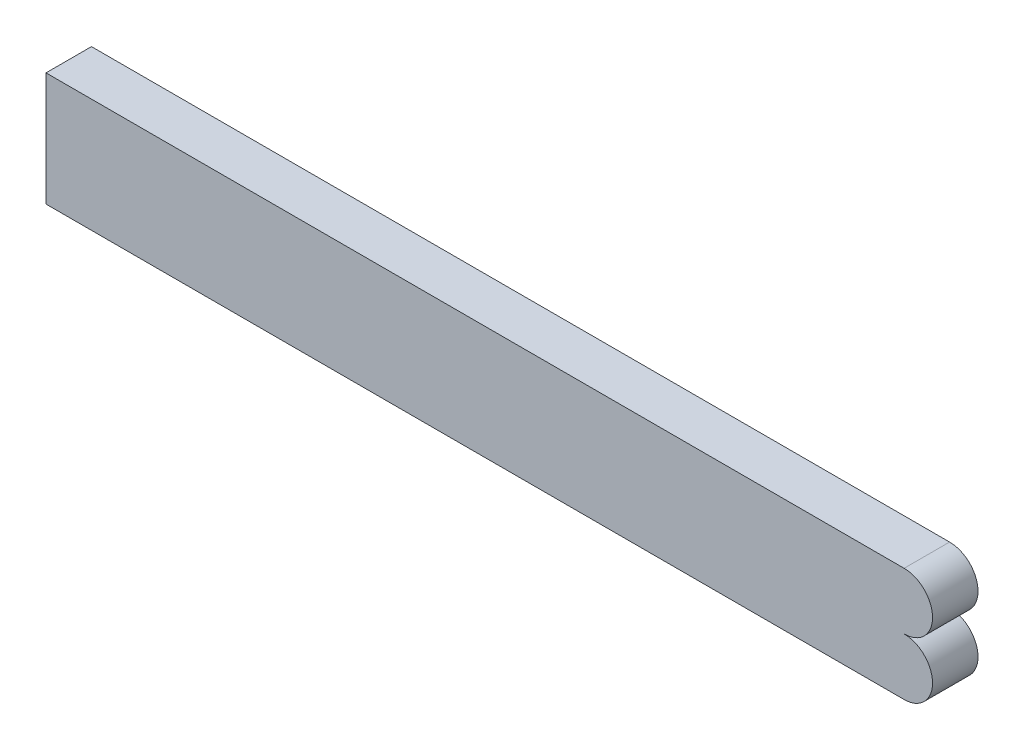
ISO-10303-21;
HEADER;
FILE_DESCRIPTION(('STEP AP214'),'2;1');
FILE_NAME('part.step','',(''),(''),'','','');
FILE_SCHEMA(('AUTOMOTIVE_DESIGN { 1 0 10303 214 1 1 1 1 }'));
ENDSEC;
DATA;
#1=APPLICATION_CONTEXT('core data for automotive mechanical design processes');
#2=APPLICATION_PROTOCOL_DEFINITION('international standard','automotive_design',2000,#1);
#3=PRODUCT_CONTEXT('',#1,'mechanical');
#4=PRODUCT('Part','Part','',(#3));
#5=PRODUCT_RELATED_PRODUCT_CATEGORY('part','',(#4));
#6=PRODUCT_DEFINITION_FORMATION('','',#4);
#7=PRODUCT_DEFINITION_CONTEXT('part definition',#1,'design');
#8=PRODUCT_DEFINITION('design','',#6,#7);
#9=PRODUCT_DEFINITION_SHAPE('','',#8);
#10=(LENGTH_UNIT() NAMED_UNIT(*) SI_UNIT(.MILLI.,.METRE.));
#11=(NAMED_UNIT(*) PLANE_ANGLE_UNIT() SI_UNIT($,.RADIAN.));
#12=(NAMED_UNIT(*) SI_UNIT($,.STERADIAN.) SOLID_ANGLE_UNIT());
#13=UNCERTAINTY_MEASURE_WITH_UNIT(LENGTH_MEASURE(1.E-05),#10,'distance_accuracy_value','');
#14=(GEOMETRIC_REPRESENTATION_CONTEXT(3) GLOBAL_UNCERTAINTY_ASSIGNED_CONTEXT((#13)) GLOBAL_UNIT_ASSIGNED_CONTEXT((#10,
#11,#12)) REPRESENTATION_CONTEXT('',''));
#15=CARTESIAN_POINT('',(0.,0.,0.));
#16=DIRECTION('',(0.,0.,1.));
#17=DIRECTION('',(1.,0.,0.));
#18=AXIS2_PLACEMENT_3D('',#15,#16,#17);
#19=CARTESIAN_POINT('',(0.,-73.7640274636036,2.));
#20=DIRECTION('',(0.,1.,0.));
#21=DIRECTION('',(0.,0.,1.));
#22=AXIS2_PLACEMENT_3D('',#19,#20,#21);
#23=PLANE('',#22);
#24=DIRECTION('',(1.,0.,0.));
#25=VECTOR('',#24,1.);
#26=CARTESIAN_POINT('',(0.,-73.7640274636036,0.));
#27=LINE('',#26,#25);
#28=CARTESIAN_POINT('',(133.073658978911,-73.7640274636036,0.));
#29=VERTEX_POINT('',#28);
#30=CARTESIAN_POINT('',(170.821054898306,-73.7640274636036,0.));
#31=VERTEX_POINT('',#30);
#32=EDGE_CURVE('E116',#29,#31,#27,.T.);
#33=ORIENTED_EDGE('',*,*,#32,.T.);
#34=DIRECTION('',(0.,0.,-1.));
#35=VECTOR('',#34,1.);
#36=CARTESIAN_POINT('',(170.821054898306,-73.7640274636036,2.));
#37=LINE('',#36,#35);
#38=CARTESIAN_POINT('',(170.821054898306,-73.7640274636036,2.));
#39=VERTEX_POINT('',#38);
#40=EDGE_CURVE('E12',#39,#31,#37,.T.);
#41=ORIENTED_EDGE('',*,*,#40,.F.);
#42=DIRECTION('',(1.,0.,0.));
#43=VECTOR('',#42,1.);
#44=CARTESIAN_POINT('',(0.,-73.7640274636036,2.));
#45=LINE('',#44,#43);
#46=CARTESIAN_POINT('',(133.073658978911,-73.7640274636036,2.));
#47=VERTEX_POINT('',#46);
#48=EDGE_CURVE('E95',#47,#39,#45,.T.);
#49=ORIENTED_EDGE('',*,*,#48,.F.);
#50=DIRECTION('',(0.,0.,-1.));
#51=VECTOR('',#50,1.);
#52=CARTESIAN_POINT('',(133.073658978911,-73.7640274636036,2.));
#53=LINE('',#52,#51);
#54=EDGE_CURVE('E127',#47,#29,#53,.T.);
#55=ORIENTED_EDGE('',*,*,#54,.T.);
#56=EDGE_LOOP('',(#33,#41,#49,#55));
#57=FACE_BOUND('',#56,.T.);
#58=ADVANCED_FACE('F49',(#57),#23,.F.);
#59=CARTESIAN_POINT('',(0.,-68.7640274636036,2.));
#60=DIRECTION('',(0.,1.,0.));
#61=DIRECTION('',(0.,0.,1.));
#62=AXIS2_PLACEMENT_3D('',#59,#60,#61);
#63=PLANE('',#62);
#64=DIRECTION('',(1.,0.,0.));
#65=VECTOR('',#64,1.);
#66=CARTESIAN_POINT('',(0.,-68.7640274636036,0.));
#67=LINE('',#66,#65);
#68=CARTESIAN_POINT('',(133.073658978911,-68.7640274636036,0.));
#69=VERTEX_POINT('',#68);
#70=CARTESIAN_POINT('',(170.821054898306,-68.7640274636036,0.));
#71=VERTEX_POINT('',#70);
#72=EDGE_CURVE('E129',#69,#71,#67,.T.);
#73=ORIENTED_EDGE('',*,*,#72,.F.);
#74=DIRECTION('',(0.,0.,-1.));
#75=VECTOR('',#74,1.);
#76=CARTESIAN_POINT('',(133.073658978911,-68.7640274636036,2.));
#77=LINE('',#76,#75);
#78=CARTESIAN_POINT('',(133.073658978911,-68.7640274636036,2.));
#79=VERTEX_POINT('',#78);
#80=EDGE_CURVE('E133',#79,#69,#77,.T.);
#81=ORIENTED_EDGE('',*,*,#80,.F.);
#82=DIRECTION('',(1.,0.,0.));
#83=VECTOR('',#82,1.);
#84=CARTESIAN_POINT('',(0.,-68.7640274636036,2.));
#85=LINE('',#84,#83);
#86=CARTESIAN_POINT('',(170.821054898306,-68.7640274636036,2.));
#87=VERTEX_POINT('',#86);
#88=EDGE_CURVE('E124',#79,#87,#85,.T.);
#89=ORIENTED_EDGE('',*,*,#88,.T.);
#90=DIRECTION('',(0.,0.,-1.));
#91=VECTOR('',#90,1.);
#92=CARTESIAN_POINT('',(170.821054898306,-68.7640274636036,2.));
#93=LINE('',#92,#91);
#94=EDGE_CURVE('E56',#87,#71,#93,.T.);
#95=ORIENTED_EDGE('',*,*,#94,.T.);
#96=EDGE_LOOP('',(#73,#81,#89,#95));
#97=FACE_BOUND('',#96,.T.);
#98=ADVANCED_FACE('F136',(#97),#63,.T.);
#99=CARTESIAN_POINT('',(133.073658978911,0.,2.));
#100=DIRECTION('',(1.,0.,0.));
#101=DIRECTION('',(0.,0.,-1.));
#102=AXIS2_PLACEMENT_3D('',#99,#100,#101);
#103=PLANE('',#102);
#104=DIRECTION('',(0.,-1.,0.));
#105=VECTOR('',#104,1.);
#106=CARTESIAN_POINT('',(133.073658978911,0.,0.));
#107=LINE('',#106,#105);
#108=EDGE_CURVE('E90',#69,#29,#107,.T.);
#109=ORIENTED_EDGE('',*,*,#108,.T.);
#110=ORIENTED_EDGE('',*,*,#54,.F.);
#111=DIRECTION('',(0.,-1.,0.));
#112=VECTOR('',#111,1.);
#113=CARTESIAN_POINT('',(133.073658978911,0.,2.));
#114=LINE('',#113,#112);
#115=EDGE_CURVE('E72',#79,#47,#114,.T.);
#116=ORIENTED_EDGE('',*,*,#115,.F.);
#117=ORIENTED_EDGE('',*,*,#80,.T.);
#118=EDGE_LOOP('',(#109,#110,#116,#117));
#119=FACE_BOUND('',#118,.T.);
#120=ADVANCED_FACE('F141',(#119),#103,.F.);
#121=CARTESIAN_POINT('',(0.,0.,2.));
#122=DIRECTION('',(0.,0.,1.));
#123=DIRECTION('',(1.,0.,0.));
#124=AXIS2_PLACEMENT_3D('',#121,#122,#123);
#125=PLANE('',#124);
#126=ORIENTED_EDGE('',*,*,#48,.T.);
#127=CARTESIAN_POINT('',(170.821054898306,-72.5140274636036,2.));
#128=DIRECTION('',(0.,0.,1.));
#129=DIRECTION('',(1.,0.,0.));
#130=AXIS2_PLACEMENT_3D('',#127,#128,#129);
#131=CIRCLE('',#130,1.25000000000001);
#132=CARTESIAN_POINT('',(170.821054898306,-71.2640274636036,2.));
#133=VERTEX_POINT('',#132);
#134=EDGE_CURVE('E108',#39,#133,#131,.T.);
#135=ORIENTED_EDGE('',*,*,#134,.T.);
#136=CARTESIAN_POINT('',(170.821054898306,-70.0140274636036,2.));
#137=DIRECTION('',(0.,0.,1.));
#138=DIRECTION('',(1.,0.,0.));
#139=AXIS2_PLACEMENT_3D('',#136,#137,#138);
#140=CIRCLE('',#139,1.25000000000001);
#141=EDGE_CURVE('E104',#133,#87,#140,.T.);
#142=ORIENTED_EDGE('',*,*,#141,.T.);
#143=ORIENTED_EDGE('',*,*,#88,.F.);
#144=ORIENTED_EDGE('',*,*,#115,.T.);
#145=EDGE_LOOP('',(#126,#135,#142,#143,#144));
#146=FACE_BOUND('',#145,.T.);
#147=ADVANCED_FACE('F118',(#146),#125,.T.);
#148=CARTESIAN_POINT('',(0.,0.,0.));
#149=DIRECTION('',(0.,0.,1.));
#150=DIRECTION('',(1.,0.,0.));
#151=AXIS2_PLACEMENT_3D('',#148,#149,#150);
#152=PLANE('',#151);
#153=ORIENTED_EDGE('',*,*,#32,.F.);
#154=ORIENTED_EDGE('',*,*,#108,.F.);
#155=ORIENTED_EDGE('',*,*,#72,.T.);
#156=CARTESIAN_POINT('',(170.821054898306,-70.0140274636036,0.));
#157=DIRECTION('',(0.,0.,1.));
#158=DIRECTION('',(1.,0.,0.));
#159=AXIS2_PLACEMENT_3D('',#156,#157,#158);
#160=CIRCLE('',#159,1.25000000000001);
#161=CARTESIAN_POINT('',(170.821054898306,-71.2640274636036,0.));
#162=VERTEX_POINT('',#161);
#163=EDGE_CURVE('E107',#162,#71,#160,.T.);
#164=ORIENTED_EDGE('',*,*,#163,.F.);
#165=CARTESIAN_POINT('',(170.821054898306,-72.5140274636036,0.));
#166=DIRECTION('',(0.,0.,1.));
#167=DIRECTION('',(1.,0.,0.));
#168=AXIS2_PLACEMENT_3D('',#165,#166,#167);
#169=CIRCLE('',#168,1.25000000000001);
#170=EDGE_CURVE('E115',#31,#162,#169,.T.);
#171=ORIENTED_EDGE('',*,*,#170,.F.);
#172=EDGE_LOOP('',(#153,#154,#155,#164,#171));
#173=FACE_BOUND('',#172,.T.);
#174=ADVANCED_FACE('F139',(#173),#152,.F.);
#175=CARTESIAN_POINT('',(170.821054898306,-70.0140274636036,0.));
#176=DIRECTION('',(0.,0.,1.));
#177=DIRECTION('',(1.,0.,0.));
#178=AXIS2_PLACEMENT_3D('',#175,#176,#177);
#179=CYLINDRICAL_SURFACE('',#178,1.25000000000001);
#180=ORIENTED_EDGE('',*,*,#141,.F.);
#181=DIRECTION('',(0.,0.,1.));
#182=VECTOR('',#181,1.);
#183=CARTESIAN_POINT('',(170.821054898306,-71.2640274636036,0.));
#184=LINE('',#183,#182);
#185=EDGE_CURVE('E63',#162,#133,#184,.T.);
#186=ORIENTED_EDGE('',*,*,#185,.F.);
#187=ORIENTED_EDGE('',*,*,#163,.T.);
#188=ORIENTED_EDGE('',*,*,#94,.F.);
#189=EDGE_LOOP('',(#180,#186,#187,#188));
#190=FACE_BOUND('',#189,.T.);
#191=ADVANCED_FACE('F105',(#190),#179,.T.);
#192=CARTESIAN_POINT('',(170.821054898306,-72.5140274636036,0.));
#193=DIRECTION('',(0.,0.,1.));
#194=DIRECTION('',(1.,0.,0.));
#195=AXIS2_PLACEMENT_3D('',#192,#193,#194);
#196=CYLINDRICAL_SURFACE('',#195,1.25000000000001);
#197=ORIENTED_EDGE('',*,*,#134,.F.);
#198=ORIENTED_EDGE('',*,*,#40,.T.);
#199=ORIENTED_EDGE('',*,*,#170,.T.);
#200=ORIENTED_EDGE('',*,*,#185,.T.);
#201=EDGE_LOOP('',(#197,#198,#199,#200));
#202=FACE_BOUND('',#201,.T.);
#203=ADVANCED_FACE('F113',(#202),#196,.T.);
#204=CLOSED_SHELL('',(#58,#98,#120,#147,#174,#191,#203));
#205=MANIFOLD_SOLID_BREP('B2',#204);
#206=ADVANCED_BREP_SHAPE_REPRESENTATION('',(#18,#205),#14);
#207=SHAPE_DEFINITION_REPRESENTATION(#9,#206);
ENDSEC;
END-ISO-10303-21;
